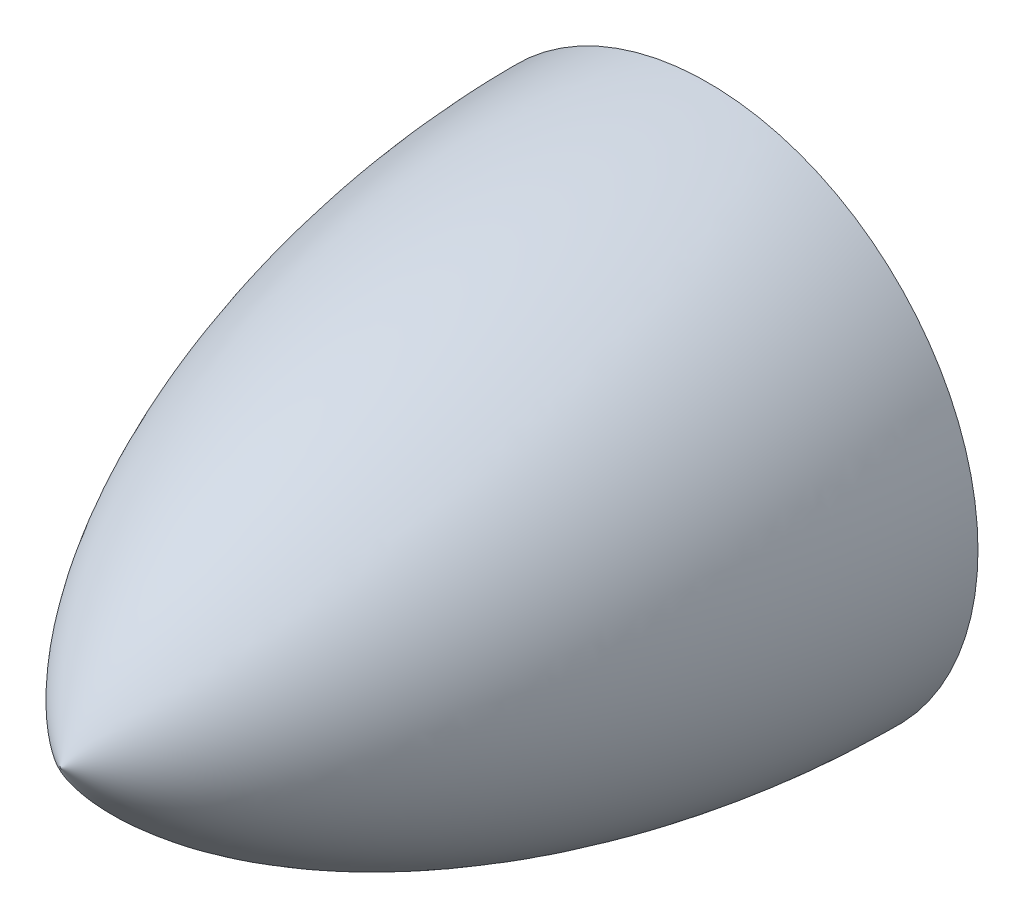
ISO-10303-21;
HEADER;
FILE_DESCRIPTION(('STEP AP214'),'2;1');
FILE_NAME('part.step','',(''),(''),'','','');
FILE_SCHEMA(('AUTOMOTIVE_DESIGN { 1 0 10303 214 1 1 1 1 }'));
ENDSEC;
DATA;
#1=APPLICATION_CONTEXT('core data for automotive mechanical design processes');
#2=APPLICATION_PROTOCOL_DEFINITION('international standard','automotive_design',2000,#1);
#3=PRODUCT_CONTEXT('',#1,'mechanical');
#4=PRODUCT('Part','Part','',(#3));
#5=PRODUCT_RELATED_PRODUCT_CATEGORY('part','',(#4));
#6=PRODUCT_DEFINITION_FORMATION('','',#4);
#7=PRODUCT_DEFINITION_CONTEXT('part definition',#1,'design');
#8=PRODUCT_DEFINITION('design','',#6,#7);
#9=PRODUCT_DEFINITION_SHAPE('','',#8);
#10=(LENGTH_UNIT() NAMED_UNIT(*) SI_UNIT(.MILLI.,.METRE.));
#11=(NAMED_UNIT(*) PLANE_ANGLE_UNIT() SI_UNIT($,.RADIAN.));
#12=(NAMED_UNIT(*) SI_UNIT($,.STERADIAN.) SOLID_ANGLE_UNIT());
#13=UNCERTAINTY_MEASURE_WITH_UNIT(LENGTH_MEASURE(1.E-05),#10,'distance_accuracy_value','');
#14=(GEOMETRIC_REPRESENTATION_CONTEXT(3) GLOBAL_UNCERTAINTY_ASSIGNED_CONTEXT((#13)) GLOBAL_UNIT_ASSIGNED_CONTEXT((#10,
#11,#12)) REPRESENTATION_CONTEXT('',''));
#15=CARTESIAN_POINT('',(0.,0.,0.));
#16=DIRECTION('',(0.,0.,1.));
#17=DIRECTION('',(1.,0.,0.));
#18=AXIS2_PLACEMENT_3D('',#15,#16,#17);
#19=CARTESIAN_POINT('',(0.,0.,152.4));
#20=CARTESIAN_POINT('',(37.7643011788051,0.,130.596770548659));
#21=CARTESIAN_POINT('',(63.4999999999998,0.,63.5336094396559));
#22=CARTESIAN_POINT('',(63.5,0.,0.));
#23=B_SPLINE_CURVE_WITH_KNOTS('',3,(#19,#20,#21,#22),.UNSPECIFIED.,.F.,.F.,(4,4),(0.,1.),.UNSPECIFIED.);
#24=CARTESIAN_POINT('',(0.,0.,0.));
#25=DIRECTION('',(0.,0.,-1.));
#26=AXIS1_PLACEMENT('',#24,#25);
#27=SURFACE_OF_REVOLUTION('',#23,#26);
#28=CARTESIAN_POINT('',(0.,0.,0.));
#29=DIRECTION('',(0.,0.,-1.));
#30=DIRECTION('',(-1.,0.,0.));
#31=AXIS2_PLACEMENT_3D('',#28,#29,#30);
#32=CIRCLE('',#31,63.5);
#33=CARTESIAN_POINT('',(-63.5,0.,0.));
#34=VERTEX_POINT('',#33);
#35=EDGE_CURVE('E11',#34,#34,#32,.T.);
#36=ORIENTED_EDGE('',*,*,#35,.F.);
#37=EDGE_LOOP('',(#36));
#38=FACE_BOUND('',#37,.T.);
#39=CARTESIAN_POINT('',(0.,0.,152.4));
#40=VERTEX_POINT('',#39);
#41=VERTEX_LOOP('',#40);
#42=FACE_BOUND('',#41,.T.);
#43=ADVANCED_FACE('F34',(#38,#42),#27,.T.);
#44=CARTESIAN_POINT('',(63.5,0.,0.));
#45=DIRECTION('',(0.,0.,1.));
#46=DIRECTION('',(1.,0.,0.));
#47=AXIS2_PLACEMENT_3D('',#44,#45,#46);
#48=PLANE('',#47);
#49=ORIENTED_EDGE('',*,*,#35,.T.);
#50=EDGE_LOOP('',(#49));
#51=FACE_BOUND('',#50,.T.);
#52=ADVANCED_FACE('F43',(#51),#48,.F.);
#53=CLOSED_SHELL('',(#43,#52));
#54=MANIFOLD_SOLID_BREP('B2',#53);
#55=ADVANCED_BREP_SHAPE_REPRESENTATION('',(#18,#54),#14);
#56=SHAPE_DEFINITION_REPRESENTATION(#9,#55);
ENDSEC;
END-ISO-10303-21;
